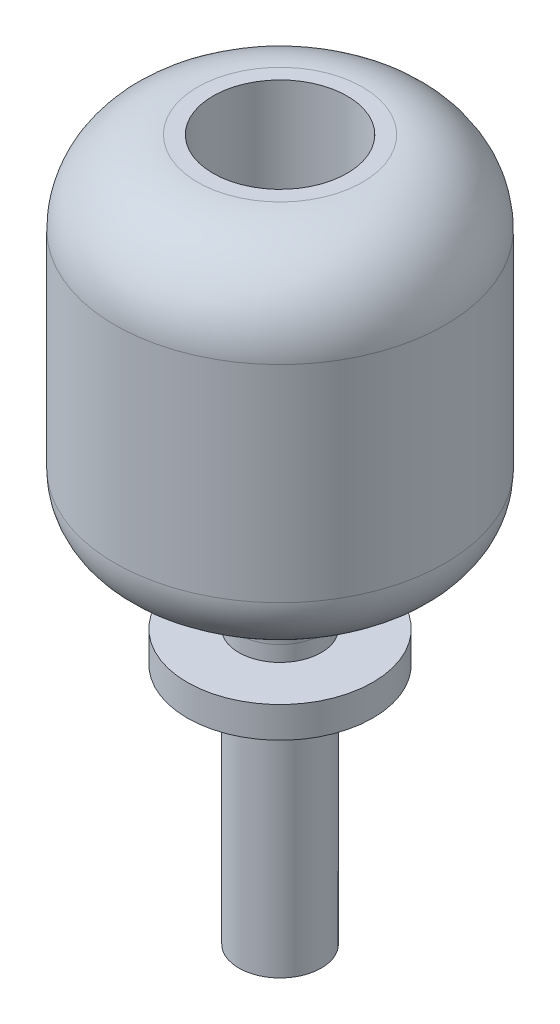
ISO-10303-21;
HEADER;
FILE_DESCRIPTION(('STEP AP214'),'2;1');
FILE_NAME('part.step','',(''),(''),'','','');
FILE_SCHEMA(('AUTOMOTIVE_DESIGN { 1 0 10303 214 1 1 1 1 }'));
ENDSEC;
DATA;
#1=APPLICATION_CONTEXT('core data for automotive mechanical design processes');
#2=APPLICATION_PROTOCOL_DEFINITION('international standard','automotive_design',2000,#1);
#3=PRODUCT_CONTEXT('',#1,'mechanical');
#4=PRODUCT('Part','Part','',(#3));
#5=PRODUCT_RELATED_PRODUCT_CATEGORY('part','',(#4));
#6=PRODUCT_DEFINITION_FORMATION('','',#4);
#7=PRODUCT_DEFINITION_CONTEXT('part definition',#1,'design');
#8=PRODUCT_DEFINITION('design','',#6,#7);
#9=PRODUCT_DEFINITION_SHAPE('','',#8);
#10=(LENGTH_UNIT() NAMED_UNIT(*) SI_UNIT(.MILLI.,.METRE.));
#11=(NAMED_UNIT(*) PLANE_ANGLE_UNIT() SI_UNIT($,.RADIAN.));
#12=(NAMED_UNIT(*) SI_UNIT($,.STERADIAN.) SOLID_ANGLE_UNIT());
#13=UNCERTAINTY_MEASURE_WITH_UNIT(LENGTH_MEASURE(1.E-05),#10,'distance_accuracy_value','');
#14=(GEOMETRIC_REPRESENTATION_CONTEXT(3) GLOBAL_UNCERTAINTY_ASSIGNED_CONTEXT((#13)) GLOBAL_UNIT_ASSIGNED_CONTEXT((#10,
#11,#12)) REPRESENTATION_CONTEXT('',''));
#15=CARTESIAN_POINT('',(0.,0.,0.));
#16=DIRECTION('',(0.,0.,1.));
#17=DIRECTION('',(1.,0.,0.));
#18=AXIS2_PLACEMENT_3D('',#15,#16,#17);
#19=CARTESIAN_POINT('',(0.,0.,0.));
#20=DIRECTION('',(0.,-1.,0.));
#21=DIRECTION('',(0.,0.,-1.));
#22=AXIS2_PLACEMENT_3D('',#19,#20,#21);
#23=CYLINDRICAL_SURFACE('',#22,4.);
#24=CARTESIAN_POINT('',(0.,14.7472822192338,0.));
#25=DIRECTION('',(0.,-1.,0.));
#26=DIRECTION('',(0.,0.,-1.));
#27=AXIS2_PLACEMENT_3D('',#24,#25,#26);
#28=CIRCLE('',#27,4.);
#29=CARTESIAN_POINT('',(0.,14.7472822192338,-4.));
#30=VERTEX_POINT('',#29);
#31=EDGE_CURVE('E76',#30,#30,#28,.T.);
#32=ORIENTED_EDGE('',*,*,#31,.T.);
#33=EDGE_LOOP('',(#32));
#34=FACE_BOUND('',#33,.T.);
#35=CARTESIAN_POINT('',(0.,13.2472822192338,0.));
#36=DIRECTION('',(0.,-1.,0.));
#37=DIRECTION('',(0.,0.,-1.));
#38=AXIS2_PLACEMENT_3D('',#35,#36,#37);
#39=CIRCLE('',#38,4.);
#40=CARTESIAN_POINT('',(0.,13.2472822192338,-4.));
#41=VERTEX_POINT('',#40);
#42=EDGE_CURVE('E10',#41,#41,#39,.T.);
#43=ORIENTED_EDGE('',*,*,#42,.F.);
#44=EDGE_LOOP('',(#43));
#45=FACE_BOUND('',#44,.T.);
#46=ADVANCED_FACE('F37',(#34,#45),#23,.T.);
#47=CARTESIAN_POINT('',(0.,54.7472822192338,0.));
#48=DIRECTION('',(0.,-1.,0.));
#49=DIRECTION('',(0.,0.,-1.));
#50=AXIS2_PLACEMENT_3D('',#47,#48,#49);
#51=PLANE('',#50);
#52=CARTESIAN_POINT('',(0.,54.7472822192338,0.));
#53=DIRECTION('',(0.,1.,0.));
#54=DIRECTION('',(0.,0.,1.));
#55=AXIS2_PLACEMENT_3D('',#52,#53,#54);
#56=CIRCLE('',#55,6.5);
#57=CARTESIAN_POINT('',(0.,54.7472822192338,6.5));
#58=VERTEX_POINT('',#57);
#59=EDGE_CURVE('E60',#58,#58,#56,.T.);
#60=ORIENTED_EDGE('',*,*,#59,.F.);
#61=EDGE_LOOP('',(#60));
#62=FACE_BOUND('',#61,.T.);
#63=CARTESIAN_POINT('',(0.,54.7472822192338,0.));
#64=DIRECTION('',(0.,-1.,0.));
#65=DIRECTION('',(0.,0.,-1.));
#66=AXIS2_PLACEMENT_3D('',#63,#64,#65);
#67=CIRCLE('',#66,8.00000000000001);
#68=CARTESIAN_POINT('',(0.,54.7472822192338,-8.00000000000001));
#69=VERTEX_POINT('',#68);
#70=EDGE_CURVE('E41',#69,#69,#67,.T.);
#71=ORIENTED_EDGE('',*,*,#70,.F.);
#72=EDGE_LOOP('',(#71));
#73=FACE_BOUND('',#72,.T.);
#74=ADVANCED_FACE('F39',(#62,#73),#51,.F.);
#75=CARTESIAN_POINT('',(0.,46.7472822192338,0.));
#76=DIRECTION('',(0.,-1.,0.));
#77=DIRECTION('',(0.,0.,-1.));
#78=AXIS2_PLACEMENT_3D('',#75,#76,#77);
#79=TOROIDAL_SURFACE('',#78,8.,8.);
#80=CARTESIAN_POINT('',(0.,46.7472822192338,0.));
#81=DIRECTION('',(0.,-1.,0.));
#82=DIRECTION('',(0.,0.,-1.));
#83=AXIS2_PLACEMENT_3D('',#80,#81,#82);
#84=CIRCLE('',#83,16.);
#85=CARTESIAN_POINT('',(0.,46.7472822192338,-16.));
#86=VERTEX_POINT('',#85);
#87=EDGE_CURVE('E51',#86,#86,#84,.T.);
#88=ORIENTED_EDGE('',*,*,#87,.F.);
#89=EDGE_LOOP('',(#88));
#90=FACE_BOUND('',#89,.T.);
#91=ORIENTED_EDGE('',*,*,#70,.T.);
#92=EDGE_LOOP('',(#91));
#93=FACE_BOUND('',#92,.T.);
#94=ADVANCED_FACE('F93',(#90,#93),#79,.T.);
#95=CARTESIAN_POINT('',(0.,0.,0.));
#96=DIRECTION('',(0.,-1.,0.));
#97=DIRECTION('',(0.,0.,-1.));
#98=AXIS2_PLACEMENT_3D('',#95,#96,#97);
#99=CYLINDRICAL_SURFACE('',#98,16.);
#100=CARTESIAN_POINT('',(0.,26.7472822192338,0.));
#101=DIRECTION('',(0.,-1.,0.));
#102=DIRECTION('',(0.,0.,-1.));
#103=AXIS2_PLACEMENT_3D('',#100,#101,#102);
#104=CIRCLE('',#103,16.);
#105=CARTESIAN_POINT('',(0.,26.7472822192338,-16.));
#106=VERTEX_POINT('',#105);
#107=EDGE_CURVE('E84',#106,#106,#104,.T.);
#108=ORIENTED_EDGE('',*,*,#107,.F.);
#109=EDGE_LOOP('',(#108));
#110=FACE_BOUND('',#109,.T.);
#111=ORIENTED_EDGE('',*,*,#87,.T.);
#112=EDGE_LOOP('',(#111));
#113=FACE_BOUND('',#112,.T.);
#114=ADVANCED_FACE('F91',(#110,#113),#99,.T.);
#115=CARTESIAN_POINT('',(0.,26.7472822192338,0.));
#116=DIRECTION('',(0.,-1.,0.));
#117=DIRECTION('',(0.,0.,-1.));
#118=AXIS2_PLACEMENT_3D('',#115,#116,#117);
#119=TOROIDAL_SURFACE('',#118,10.,6.);
#120=CARTESIAN_POINT('',(0.,20.7472822192338,0.));
#121=DIRECTION('',(0.,-1.,0.));
#122=DIRECTION('',(0.,0.,-1.));
#123=AXIS2_PLACEMENT_3D('',#120,#121,#122);
#124=CIRCLE('',#123,10.);
#125=CARTESIAN_POINT('',(0.,20.7472822192338,-10.));
#126=VERTEX_POINT('',#125);
#127=EDGE_CURVE('E80',#126,#126,#124,.T.);
#128=ORIENTED_EDGE('',*,*,#127,.F.);
#129=EDGE_LOOP('',(#128));
#130=FACE_BOUND('',#129,.T.);
#131=ORIENTED_EDGE('',*,*,#107,.T.);
#132=EDGE_LOOP('',(#131));
#133=FACE_BOUND('',#132,.T.);
#134=ADVANCED_FACE('F131',(#130,#133),#119,.T.);
#135=CARTESIAN_POINT('',(0.,14.7472822192338,0.));
#136=DIRECTION('',(0.,-1.,0.));
#137=DIRECTION('',(0.,0.,-1.));
#138=AXIS2_PLACEMENT_3D('',#135,#136,#137);
#139=TOROIDAL_SURFACE('',#138,10.,6.);
#140=ORIENTED_EDGE('',*,*,#31,.F.);
#141=EDGE_LOOP('',(#140));
#142=FACE_BOUND('',#141,.T.);
#143=ORIENTED_EDGE('',*,*,#127,.T.);
#144=EDGE_LOOP('',(#143));
#145=FACE_BOUND('',#144,.T.);
#146=ADVANCED_FACE('F127',(#142,#145),#139,.F.);
#147=CARTESIAN_POINT('',(0.,10.2472822192338,0.));
#148=DIRECTION('',(0.,-1.,0.));
#149=DIRECTION('',(0.,0.,-1.));
#150=AXIS2_PLACEMENT_3D('',#147,#148,#149);
#151=CIRCLE('',#150,4.);
#152=CARTESIAN_POINT('',(0.,10.2472822192338,-4.));
#153=VERTEX_POINT('',#152);
#154=EDGE_CURVE('E54',#153,#153,#151,.T.);
#155=ORIENTED_EDGE('',*,*,#154,.T.);
#156=EDGE_LOOP('',(#155));
#157=FACE_BOUND('',#156,.T.);
#158=CARTESIAN_POINT('',(0.,-13.2527177807662,0.));
#159=DIRECTION('',(0.,-1.,0.));
#160=DIRECTION('',(0.,0.,-1.));
#161=AXIS2_PLACEMENT_3D('',#158,#159,#160);
#162=CIRCLE('',#161,4.);
#163=CARTESIAN_POINT('',(0.,-13.2527177807662,-4.));
#164=VERTEX_POINT('',#163);
#165=EDGE_CURVE('E69',#164,#164,#162,.T.);
#166=ORIENTED_EDGE('',*,*,#165,.F.);
#167=EDGE_LOOP('',(#166));
#168=FACE_BOUND('',#167,.T.);
#169=ADVANCED_FACE('F105',(#157,#168),#23,.T.);
#170=CARTESIAN_POINT('',(0.,-13.2527177807662,0.));
#171=DIRECTION('',(0.,1.,0.));
#172=DIRECTION('',(0.,0.,1.));
#173=AXIS2_PLACEMENT_3D('',#170,#171,#172);
#174=PLANE('',#173);
#175=CARTESIAN_POINT('',(0.,-13.2527177807662,0.));
#176=DIRECTION('',(0.,-1.,0.));
#177=DIRECTION('',(0.,0.,-1.));
#178=AXIS2_PLACEMENT_3D('',#175,#176,#177);
#179=CIRCLE('',#178,2.);
#180=CARTESIAN_POINT('',(0.,-13.2527177807662,-2.));
#181=VERTEX_POINT('',#180);
#182=EDGE_CURVE('E56',#181,#181,#179,.T.);
#183=ORIENTED_EDGE('',*,*,#182,.F.);
#184=EDGE_LOOP('',(#183));
#185=FACE_BOUND('',#184,.T.);
#186=ORIENTED_EDGE('',*,*,#165,.T.);
#187=EDGE_LOOP('',(#186));
#188=FACE_BOUND('',#187,.T.);
#189=ADVANCED_FACE('F111',(#185,#188),#174,.F.);
#190=CARTESIAN_POINT('',(0.,24.7472822192338,0.));
#191=DIRECTION('',(0.,1.,0.));
#192=DIRECTION('',(0.,0.,1.));
#193=AXIS2_PLACEMENT_3D('',#190,#191,#192);
#194=CYLINDRICAL_SURFACE('',#193,6.5);
#195=CARTESIAN_POINT('',(0.,24.7472822192338,0.));
#196=DIRECTION('',(0.,1.,0.));
#197=DIRECTION('',(0.,0.,1.));
#198=AXIS2_PLACEMENT_3D('',#195,#196,#197);
#199=CIRCLE('',#198,6.5);
#200=CARTESIAN_POINT('',(0.,24.7472822192338,6.5));
#201=VERTEX_POINT('',#200);
#202=EDGE_CURVE('E65',#201,#201,#199,.T.);
#203=ORIENTED_EDGE('',*,*,#202,.F.);
#204=EDGE_LOOP('',(#203));
#205=FACE_BOUND('',#204,.T.);
#206=ORIENTED_EDGE('',*,*,#59,.T.);
#207=EDGE_LOOP('',(#206));
#208=FACE_BOUND('',#207,.T.);
#209=ADVANCED_FACE('F108',(#205,#208),#194,.F.);
#210=CARTESIAN_POINT('',(0.,24.7472822192338,0.));
#211=DIRECTION('',(0.,1.,0.));
#212=DIRECTION('',(0.,0.,1.));
#213=AXIS2_PLACEMENT_3D('',#210,#211,#212);
#214=PLANE('',#213);
#215=CARTESIAN_POINT('',(0.,24.7472822192338,0.));
#216=DIRECTION('',(0.,1.,0.));
#217=DIRECTION('',(0.,0.,1.));
#218=AXIS2_PLACEMENT_3D('',#215,#216,#217);
#219=CIRCLE('',#218,2.);
#220=CARTESIAN_POINT('',(0.,24.7472822192338,2.));
#221=VERTEX_POINT('',#220);
#222=EDGE_CURVE('E61',#221,#221,#219,.F.);
#223=ORIENTED_EDGE('',*,*,#222,.T.);
#224=EDGE_LOOP('',(#223));
#225=FACE_BOUND('',#224,.T.);
#226=ORIENTED_EDGE('',*,*,#202,.T.);
#227=EDGE_LOOP('',(#226));
#228=FACE_BOUND('',#227,.T.);
#229=ADVANCED_FACE('F110',(#225,#228),#214,.T.);
#230=CARTESIAN_POINT('',(0.,54.7482822192338,0.));
#231=DIRECTION('',(0.,-1.,0.));
#232=DIRECTION('',(0.,0.,-1.));
#233=AXIS2_PLACEMENT_3D('',#230,#231,#232);
#234=CYLINDRICAL_SURFACE('',#233,2.);
#235=ORIENTED_EDGE('',*,*,#182,.T.);
#236=EDGE_LOOP('',(#235));
#237=FACE_BOUND('',#236,.T.);
#238=ORIENTED_EDGE('',*,*,#222,.F.);
#239=EDGE_LOOP('',(#238));
#240=FACE_BOUND('',#239,.T.);
#241=ADVANCED_FACE('F118',(#237,#240),#234,.F.);
#242=CARTESIAN_POINT('',(0.,13.2472822192338,0.));
#243=DIRECTION('',(0.,-1.,0.));
#244=DIRECTION('',(0.,0.,-1.));
#245=AXIS2_PLACEMENT_3D('',#242,#243,#244);
#246=PLANE('',#245);
#247=CARTESIAN_POINT('',(0.,13.2472822192338,0.));
#248=DIRECTION('',(0.,-1.,0.));
#249=DIRECTION('',(0.,0.,-1.));
#250=AXIS2_PLACEMENT_3D('',#247,#248,#249);
#251=CIRCLE('',#250,9.);
#252=CARTESIAN_POINT('',(0.,13.2472822192338,-9.));
#253=VERTEX_POINT('',#252);
#254=EDGE_CURVE('E226',#253,#253,#251,.T.);
#255=ORIENTED_EDGE('',*,*,#254,.F.);
#256=EDGE_LOOP('',(#255));
#257=FACE_BOUND('',#256,.T.);
#258=ORIENTED_EDGE('',*,*,#42,.T.);
#259=EDGE_LOOP('',(#258));
#260=FACE_BOUND('',#259,.T.);
#261=ADVANCED_FACE('F184',(#257,#260),#246,.F.);
#262=CARTESIAN_POINT('',(0.,10.2472822192338,0.));
#263=DIRECTION('',(0.,-1.,0.));
#264=DIRECTION('',(0.,0.,-1.));
#265=AXIS2_PLACEMENT_3D('',#262,#263,#264);
#266=PLANE('',#265);
#267=CARTESIAN_POINT('',(0.,10.2472822192338,0.));
#268=DIRECTION('',(0.,-1.,0.));
#269=DIRECTION('',(0.,0.,-1.));
#270=AXIS2_PLACEMENT_3D('',#267,#268,#269);
#271=CIRCLE('',#270,9.);
#272=CARTESIAN_POINT('',(0.,10.2472822192338,-9.));
#273=VERTEX_POINT('',#272);
#274=EDGE_CURVE('E229',#273,#273,#271,.T.);
#275=ORIENTED_EDGE('',*,*,#274,.T.);
#276=EDGE_LOOP('',(#275));
#277=FACE_BOUND('',#276,.T.);
#278=ORIENTED_EDGE('',*,*,#154,.F.);
#279=EDGE_LOOP('',(#278));
#280=FACE_BOUND('',#279,.T.);
#281=ADVANCED_FACE('F190',(#277,#280),#266,.T.);
#282=CARTESIAN_POINT('',(0.,13.2472822192338,0.));
#283=DIRECTION('',(0.,-1.,0.));
#284=DIRECTION('',(0.,0.,-1.));
#285=AXIS2_PLACEMENT_3D('',#282,#283,#284);
#286=CYLINDRICAL_SURFACE('',#285,9.);
#287=ORIENTED_EDGE('',*,*,#254,.T.);
#288=EDGE_LOOP('',(#287));
#289=FACE_BOUND('',#288,.T.);
#290=ORIENTED_EDGE('',*,*,#274,.F.);
#291=EDGE_LOOP('',(#290));
#292=FACE_BOUND('',#291,.T.);
#293=ADVANCED_FACE('F199',(#289,#292),#286,.T.);
#294=CLOSED_SHELL('',(#46,#74,#94,#114,#134,#146,#169,#189,#209,#229,#241,#261,#281,#293));
#295=MANIFOLD_SOLID_BREP('B2',#294);
#296=ADVANCED_BREP_SHAPE_REPRESENTATION('',(#18,#295),#14);
#297=SHAPE_DEFINITION_REPRESENTATION(#9,#296);
ENDSEC;
END-ISO-10303-21;
